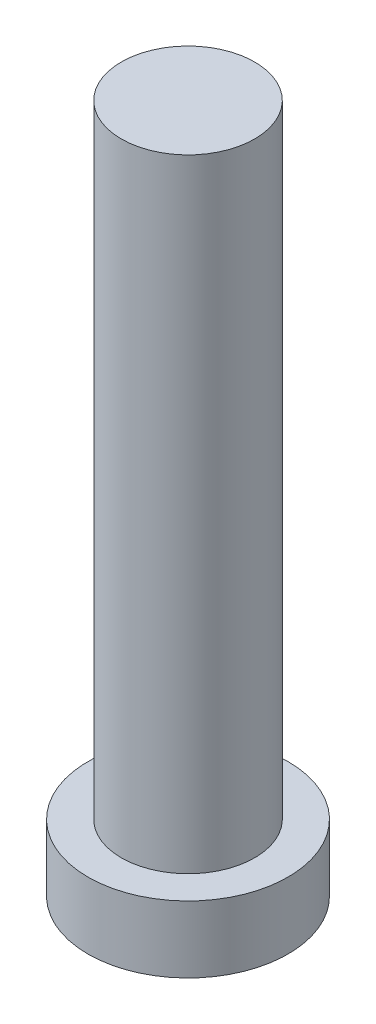
ISO-10303-21;
HEADER;
FILE_DESCRIPTION(('STEP AP214'),'2;1');
FILE_NAME('part.step','',(''),(''),'','','');
FILE_SCHEMA(('AUTOMOTIVE_DESIGN { 1 0 10303 214 1 1 1 1 }'));
ENDSEC;
DATA;
#1=APPLICATION_CONTEXT('core data for automotive mechanical design processes');
#2=APPLICATION_PROTOCOL_DEFINITION('international standard','automotive_design',2000,#1);
#3=PRODUCT_CONTEXT('',#1,'mechanical');
#4=PRODUCT('Part','Part','',(#3));
#5=PRODUCT_RELATED_PRODUCT_CATEGORY('part','',(#4));
#6=PRODUCT_DEFINITION_FORMATION('','',#4);
#7=PRODUCT_DEFINITION_CONTEXT('part definition',#1,'design');
#8=PRODUCT_DEFINITION('design','',#6,#7);
#9=PRODUCT_DEFINITION_SHAPE('','',#8);
#10=(LENGTH_UNIT() NAMED_UNIT(*) SI_UNIT(.MILLI.,.METRE.));
#11=(NAMED_UNIT(*) PLANE_ANGLE_UNIT() SI_UNIT($,.RADIAN.));
#12=(NAMED_UNIT(*) SI_UNIT($,.STERADIAN.) SOLID_ANGLE_UNIT());
#13=UNCERTAINTY_MEASURE_WITH_UNIT(LENGTH_MEASURE(1.E-05),#10,'distance_accuracy_value','');
#14=(GEOMETRIC_REPRESENTATION_CONTEXT(3) GLOBAL_UNCERTAINTY_ASSIGNED_CONTEXT((#13)) GLOBAL_UNIT_ASSIGNED_CONTEXT((#10,
#11,#12)) REPRESENTATION_CONTEXT('',''));
#15=CARTESIAN_POINT('',(0.,0.,0.));
#16=DIRECTION('',(0.,0.,1.));
#17=DIRECTION('',(1.,0.,0.));
#18=AXIS2_PLACEMENT_3D('',#15,#16,#17);
#19=CARTESIAN_POINT('',(0.,6.375,0.));
#20=DIRECTION('',(0.,-1.,0.));
#21=DIRECTION('',(0.,0.,-1.));
#22=AXIS2_PLACEMENT_3D('',#19,#20,#21);
#23=CYLINDRICAL_SURFACE('',#22,5.625);
#24=CARTESIAN_POINT('',(0.,6.375,0.));
#25=DIRECTION('',(0.,1.,0.));
#26=DIRECTION('',(0.,0.,1.));
#27=AXIS2_PLACEMENT_3D('',#24,#25,#26);
#28=CIRCLE('',#27,5.625);
#29=CARTESIAN_POINT('',(0.,6.375,5.625));
#30=VERTEX_POINT('',#29);
#31=EDGE_CURVE('E51',#30,#30,#28,.T.);
#32=ORIENTED_EDGE('',*,*,#31,.F.);
#33=EDGE_LOOP('',(#32));
#34=FACE_BOUND('',#33,.T.);
#35=CARTESIAN_POINT('',(0.,2.625,0.));
#36=DIRECTION('',(0.,1.,0.));
#37=DIRECTION('',(0.,0.,1.));
#38=AXIS2_PLACEMENT_3D('',#35,#36,#37);
#39=CIRCLE('',#38,5.625);
#40=CARTESIAN_POINT('',(0.,2.625,5.625));
#41=VERTEX_POINT('',#40);
#42=EDGE_CURVE('E46',#41,#41,#39,.T.);
#43=ORIENTED_EDGE('',*,*,#42,.T.);
#44=EDGE_LOOP('',(#43));
#45=FACE_BOUND('',#44,.T.);
#46=ADVANCED_FACE('F43',(#34,#45),#23,.T.);
#47=CARTESIAN_POINT('',(0.,6.375,0.));
#48=DIRECTION('',(0.,1.,0.));
#49=DIRECTION('',(0.,0.,1.));
#50=AXIS2_PLACEMENT_3D('',#47,#48,#49);
#51=PLANE('',#50);
#52=CARTESIAN_POINT('',(0.,6.375,0.));
#53=DIRECTION('',(0.,1.,0.));
#54=DIRECTION('',(0.,0.,1.));
#55=AXIS2_PLACEMENT_3D('',#52,#53,#54);
#56=CIRCLE('',#55,3.75);
#57=CARTESIAN_POINT('',(0.,6.375,3.75));
#58=VERTEX_POINT('',#57);
#59=EDGE_CURVE('E10',#58,#58,#56,.T.);
#60=ORIENTED_EDGE('',*,*,#59,.F.);
#61=EDGE_LOOP('',(#60));
#62=FACE_BOUND('',#61,.T.);
#63=ORIENTED_EDGE('',*,*,#31,.T.);
#64=EDGE_LOOP('',(#63));
#65=FACE_BOUND('',#64,.T.);
#66=ADVANCED_FACE('F71',(#62,#65),#51,.T.);
#67=CARTESIAN_POINT('',(0.,2.625,0.));
#68=DIRECTION('',(0.,1.,0.));
#69=DIRECTION('',(0.,0.,1.));
#70=AXIS2_PLACEMENT_3D('',#67,#68,#69);
#71=PLANE('',#70);
#72=ORIENTED_EDGE('',*,*,#42,.F.);
#73=EDGE_LOOP('',(#72));
#74=FACE_BOUND('',#73,.T.);
#75=ADVANCED_FACE('F68',(#74),#71,.F.);
#76=CARTESIAN_POINT('',(0.,21.375,0.));
#77=DIRECTION('',(0.,-1.,0.));
#78=DIRECTION('',(0.,0.,-1.));
#79=AXIS2_PLACEMENT_3D('',#76,#77,#78);
#80=CYLINDRICAL_SURFACE('',#79,3.75);
#81=ORIENTED_EDGE('',*,*,#59,.T.);
#82=EDGE_LOOP('',(#81));
#83=FACE_BOUND('',#82,.T.);
#84=CARTESIAN_POINT('',(0.,41.375,0.));
#85=DIRECTION('',(0.,1.,0.));
#86=DIRECTION('',(0.,0.,1.));
#87=AXIS2_PLACEMENT_3D('',#84,#85,#86);
#88=CIRCLE('',#87,3.75);
#89=CARTESIAN_POINT('',(0.,41.375,3.75));
#90=VERTEX_POINT('',#89);
#91=EDGE_CURVE('E58',#90,#90,#88,.T.);
#92=ORIENTED_EDGE('',*,*,#91,.F.);
#93=EDGE_LOOP('',(#92));
#94=FACE_BOUND('',#93,.T.);
#95=ADVANCED_FACE('F70',(#83,#94),#80,.T.);
#96=CARTESIAN_POINT('',(0.,41.375,0.));
#97=DIRECTION('',(0.,1.,0.));
#98=DIRECTION('',(0.,0.,1.));
#99=AXIS2_PLACEMENT_3D('',#96,#97,#98);
#100=PLANE('',#99);
#101=ORIENTED_EDGE('',*,*,#91,.T.);
#102=EDGE_LOOP('',(#101));
#103=FACE_BOUND('',#102,.T.);
#104=ADVANCED_FACE('F76',(#103),#100,.T.);
#105=CLOSED_SHELL('',(#46,#66,#75,#95,#104));
#106=MANIFOLD_SOLID_BREP('B2',#105);
#107=ADVANCED_BREP_SHAPE_REPRESENTATION('',(#18,#106),#14);
#108=SHAPE_DEFINITION_REPRESENTATION(#9,#107);
ENDSEC;
END-ISO-10303-21;
